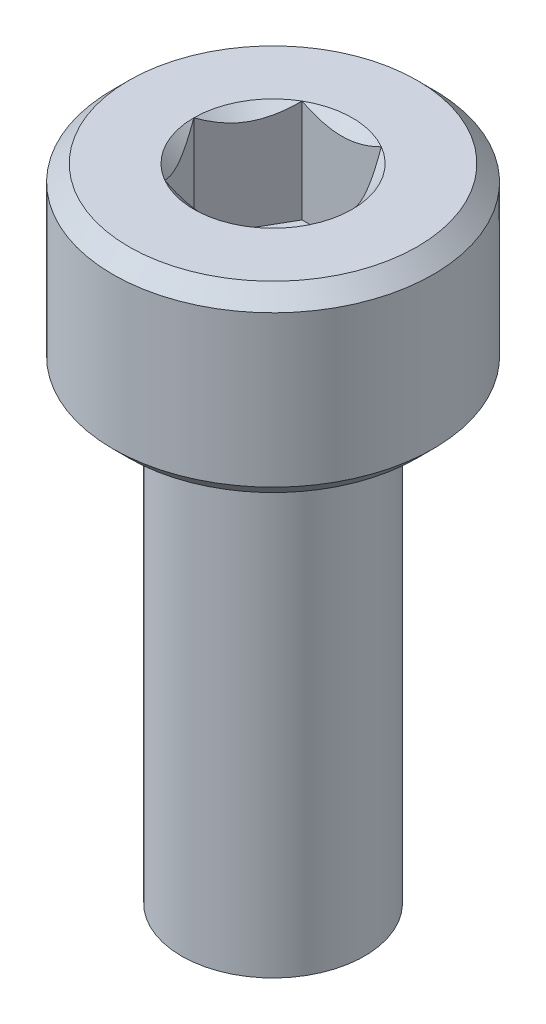
ISO-10303-21;
HEADER;
FILE_DESCRIPTION(('STEP AP214'),'2;1');
FILE_NAME('part.step','',(''),(''),'','','');
FILE_SCHEMA(('AUTOMOTIVE_DESIGN { 1 0 10303 214 1 1 1 1 }'));
ENDSEC;
DATA;
#1=APPLICATION_CONTEXT('core data for automotive mechanical design processes');
#2=APPLICATION_PROTOCOL_DEFINITION('international standard','automotive_design',2000,#1);
#3=PRODUCT_CONTEXT('',#1,'mechanical');
#4=PRODUCT('Part','Part','',(#3));
#5=PRODUCT_RELATED_PRODUCT_CATEGORY('part','',(#4));
#6=PRODUCT_DEFINITION_FORMATION('','',#4);
#7=PRODUCT_DEFINITION_CONTEXT('part definition',#1,'design');
#8=PRODUCT_DEFINITION('design','',#6,#7);
#9=PRODUCT_DEFINITION_SHAPE('','',#8);
#10=(LENGTH_UNIT() NAMED_UNIT(*) SI_UNIT(.MILLI.,.METRE.));
#11=(NAMED_UNIT(*) PLANE_ANGLE_UNIT() SI_UNIT($,.RADIAN.));
#12=(NAMED_UNIT(*) SI_UNIT($,.STERADIAN.) SOLID_ANGLE_UNIT());
#13=UNCERTAINTY_MEASURE_WITH_UNIT(LENGTH_MEASURE(1.E-05),#10,'distance_accuracy_value','');
#14=(GEOMETRIC_REPRESENTATION_CONTEXT(3) GLOBAL_UNCERTAINTY_ASSIGNED_CONTEXT((#13)) GLOBAL_UNIT_ASSIGNED_CONTEXT((#10,
#11,#12)) REPRESENTATION_CONTEXT('',''));
#15=CARTESIAN_POINT('',(0.,0.,0.));
#16=DIRECTION('',(0.,0.,1.));
#17=DIRECTION('',(1.,0.,0.));
#18=AXIS2_PLACEMENT_3D('',#15,#16,#17);
#19=CARTESIAN_POINT('',(0.,4.,0.));
#20=DIRECTION('',(0.,-1.,0.));
#21=DIRECTION('',(0.,0.,-1.));
#22=AXIS2_PLACEMENT_3D('',#19,#20,#21);
#23=CYLINDRICAL_SURFACE('',#22,3.5);
#24=CARTESIAN_POINT('',(0.,0.350000000000001,0.));
#25=DIRECTION('',(0.,1.,0.));
#26=DIRECTION('',(0.,0.,1.));
#27=AXIS2_PLACEMENT_3D('',#24,#25,#26);
#28=CIRCLE('',#27,3.5);
#29=CARTESIAN_POINT('',(0.,0.350000000000001,3.5));
#30=VERTEX_POINT('',#29);
#31=EDGE_CURVE('E222',#30,#30,#28,.T.);
#32=ORIENTED_EDGE('',*,*,#31,.T.);
#33=EDGE_LOOP('',(#32));
#34=FACE_BOUND('',#33,.T.);
#35=CARTESIAN_POINT('',(0.,3.65,0.));
#36=DIRECTION('',(0.,1.,0.));
#37=DIRECTION('',(0.,0.,1.));
#38=AXIS2_PLACEMENT_3D('',#35,#36,#37);
#39=CIRCLE('',#38,3.5);
#40=CARTESIAN_POINT('',(0.,3.65,3.5));
#41=VERTEX_POINT('',#40);
#42=EDGE_CURVE('E105',#41,#41,#39,.F.);
#43=ORIENTED_EDGE('',*,*,#42,.T.);
#44=EDGE_LOOP('',(#43));
#45=FACE_BOUND('',#44,.T.);
#46=ADVANCED_FACE('F33',(#34,#45),#23,.T.);
#47=CARTESIAN_POINT('',(0.,4.,0.));
#48=DIRECTION('',(0.,1.,0.));
#49=DIRECTION('',(0.,0.,1.));
#50=AXIS2_PLACEMENT_3D('',#47,#48,#49);
#51=PLANE('',#50);
#52=CARTESIAN_POINT('',(0.,4.,0.));
#53=DIRECTION('',(0.,1.,0.));
#54=DIRECTION('',(0.,0.,1.));
#55=AXIS2_PLACEMENT_3D('',#52,#53,#54);
#56=CIRCLE('',#55,3.15);
#57=CARTESIAN_POINT('',(0.,4.,3.15));
#58=VERTEX_POINT('',#57);
#59=EDGE_CURVE('E37',#58,#58,#56,.T.);
#60=ORIENTED_EDGE('',*,*,#59,.T.);
#61=EDGE_LOOP('',(#60));
#62=FACE_BOUND('',#61,.T.);
#63=CARTESIAN_POINT('',(0.,4.,0.));
#64=DIRECTION('',(0.,1.,0.));
#65=DIRECTION('',(0.,0.,1.));
#66=AXIS2_PLACEMENT_3D('',#63,#64,#65);
#67=CIRCLE('',#66,1.73205080756888);
#68=CARTESIAN_POINT('',(0.866025403784438,4.,1.5));
#69=VERTEX_POINT('',#68);
#70=CARTESIAN_POINT('',(1.73205080756888,4.,0.));
#71=VERTEX_POINT('',#70);
#72=EDGE_CURVE('E48',#69,#71,#67,.T.);
#73=ORIENTED_EDGE('',*,*,#72,.F.);
#74=CARTESIAN_POINT('',(-0.866025403784438,4.,1.5));
#75=VERTEX_POINT('',#74);
#76=EDGE_CURVE('E55',#75,#69,#67,.T.);
#77=ORIENTED_EDGE('',*,*,#76,.F.);
#78=CARTESIAN_POINT('',(-1.73205080756888,4.,0.));
#79=VERTEX_POINT('',#78);
#80=EDGE_CURVE('E128',#79,#75,#67,.T.);
#81=ORIENTED_EDGE('',*,*,#80,.F.);
#82=CARTESIAN_POINT('',(-0.866025403784439,4.,-1.5));
#83=VERTEX_POINT('',#82);
#84=EDGE_CURVE('E127',#83,#79,#67,.T.);
#85=ORIENTED_EDGE('',*,*,#84,.F.);
#86=CARTESIAN_POINT('',(0.866025403784438,4.,-1.5));
#87=VERTEX_POINT('',#86);
#88=EDGE_CURVE('E95',#87,#83,#67,.T.);
#89=ORIENTED_EDGE('',*,*,#88,.F.);
#90=EDGE_CURVE('E87',#71,#87,#67,.T.);
#91=ORIENTED_EDGE('',*,*,#90,.F.);
#92=EDGE_LOOP('',(#73,#77,#81,#85,#89,#91));
#93=FACE_BOUND('',#92,.T.);
#94=ADVANCED_FACE('F125',(#62,#93),#51,.T.);
#95=CARTESIAN_POINT('',(0.,0.,0.));
#96=DIRECTION('',(0.,1.,0.));
#97=DIRECTION('',(0.,0.,1.));
#98=AXIS2_PLACEMENT_3D('',#95,#96,#97);
#99=PLANE('',#98);
#100=CARTESIAN_POINT('',(0.,0.,0.));
#101=DIRECTION('',(0.,-1.,0.));
#102=DIRECTION('',(0.,0.,-1.));
#103=AXIS2_PLACEMENT_3D('',#100,#101,#102);
#104=CIRCLE('',#103,2.);
#105=CARTESIAN_POINT('',(0.,0.,-2.));
#106=VERTEX_POINT('',#105);
#107=EDGE_CURVE('E11',#106,#106,#104,.T.);
#108=ORIENTED_EDGE('',*,*,#107,.F.);
#109=EDGE_LOOP('',(#108));
#110=FACE_BOUND('',#109,.T.);
#111=CARTESIAN_POINT('',(0.,0.,0.));
#112=DIRECTION('',(0.,1.,0.));
#113=DIRECTION('',(0.,0.,1.));
#114=AXIS2_PLACEMENT_3D('',#111,#112,#113);
#115=CIRCLE('',#114,3.15);
#116=CARTESIAN_POINT('',(0.,0.,3.15));
#117=VERTEX_POINT('',#116);
#118=EDGE_CURVE('E220',#117,#117,#115,.F.);
#119=ORIENTED_EDGE('',*,*,#118,.T.);
#120=EDGE_LOOP('',(#119));
#121=FACE_BOUND('',#120,.T.);
#122=ADVANCED_FACE('F203',(#110,#121),#99,.F.);
#123=CARTESIAN_POINT('',(0.,4.,0.));
#124=DIRECTION('',(0.,1.,0.));
#125=DIRECTION('',(0.,0.,1.));
#126=AXIS2_PLACEMENT_3D('',#123,#124,#125);
#127=CONICAL_SURFACE('',#126,1.73205080756888,0.78539816339745);
#128=ORIENTED_EDGE('',*,*,#88,.T.);
#129=CARTESIAN_POINT('',(-1.72720812969692,4.55557851627079,-1.5));
#130=CARTESIAN_POINT('',(-1.68515175699268,4.52382990785743,-1.5));
#131=CARTESIAN_POINT('',(-1.64286104748673,4.49239259380738,-1.5));
#132=CARTESIAN_POINT('',(-1.55771581035942,4.43026908755641,-1.5));
#133=CARTESIAN_POINT('',(-1.51486114386668,4.3995830858922,-1.5));
#134=CARTESIAN_POINT('',(-1.3846813415127,4.30840719242716,-1.5));
#135=CARTESIAN_POINT('',(-1.29637976071654,4.24928834342677,-1.5));
#136=CARTESIAN_POINT('',(-1.11121478730467,4.1332309963165,-1.5));
#137=CARTESIAN_POINT('',(-1.01415038238167,4.07660955873301,-1.5));
#138=CARTESIAN_POINT('',(-0.815173408897606,3.97303688126565,-1.5));
#139=CARTESIAN_POINT('',(-0.713278669253285,3.92605304154167,-1.5));
#140=CARTESIAN_POINT('',(-0.560333774943112,3.86857266843083,-1.5));
#141=CARTESIAN_POINT('',(-0.511547982948042,3.85207538775725,-1.5));
#142=CARTESIAN_POINT('',(-0.412798620136866,3.822997512927,-1.5));
#143=CARTESIAN_POINT('',(-0.362834968437563,3.81041718859402,-1.5));
#144=CARTESIAN_POINT('',(-0.262863235444982,3.79003619414677,-1.5));
#145=CARTESIAN_POINT('',(-0.212872113808023,3.78215363274598,-1.5));
#146=CARTESIAN_POINT('',(-0.112355243569545,3.771322063969,-1.5));
#147=CARTESIAN_POINT('',(-0.0618295883726279,3.76837220852435,-1.5));
#148=CARTESIAN_POINT('',(0.037429173332384,3.76762485772485,-1.5));
#149=CARTESIAN_POINT('',(0.0861609672002989,3.76964473355808,-1.5));
#150=CARTESIAN_POINT('',(0.183206937768827,3.77832255289676,-1.5));
#151=CARTESIAN_POINT('',(0.231521073438269,3.78498094696846,-1.5));
#152=CARTESIAN_POINT('',(0.328199853425436,3.80268524412257,-1.5));
#153=CARTESIAN_POINT('',(0.376550616310328,3.81380581125704,-1.5));
#154=CARTESIAN_POINT('',(0.472195697125598,3.83984341404871,-1.5));
#155=CARTESIAN_POINT('',(0.51949010309274,3.85476013204094,-1.5));
#156=CARTESIAN_POINT('',(0.668391282696624,3.90733522359607,-1.5));
#157=CARTESIAN_POINT('',(0.767878709508552,3.95098128747198,-1.5));
#158=CARTESIAN_POINT('',(0.962179866690724,4.0480229945931,-1.5));
#159=CARTESIAN_POINT('',(1.05697519961444,4.10145366508953,-1.5));
#160=CARTESIAN_POINT('',(1.23814273533383,4.21168585200456,-1.5));
#161=CARTESIAN_POINT('',(1.3246994218129,4.2681879206986,-1.5));
#162=CARTESIAN_POINT('',(1.45222331290673,4.35553430157866,-1.5));
#163=CARTESIAN_POINT('',(1.49418091978756,4.38495775868004,-1.5));
#164=CARTESIAN_POINT('',(1.57752272931476,4.44458282183046,-1.5));
#165=CARTESIAN_POINT('',(1.61890708647354,4.47478421166444,-1.5));
#166=CARTESIAN_POINT('',(1.66005278019494,4.50530817860946,-1.5));
#167=B_SPLINE_CURVE_WITH_KNOTS('',3,(#129,#130,#131,#132,#133,#134,#135,#136,#137,#138,#139,
#140,#141,#142,#143,#144,#145,#146,#147,#148,#149,#150,#151,#152,#153,#154,#155,#156,#157,#158,
#159,#160,#161,#162,#163,#164,#165,#166),.UNSPECIFIED.,.F.,.F.,(4,2,2,2,2,2,2,2,2,2,2,2,2,2,2,2,
2,2,4),(0.,0.158079548982669,0.316198780993942,0.634850417346958,0.971690311361509,
1.30737131660667,1.46173961127089,1.61611853740677,1.76772101421409,1.91929742368538,
2.065387412096,2.21149159305544,2.36014984633872,2.50879566386709,2.83376031422673,
3.15991186985652,3.46985601802197,3.62358896039974,3.7772796264207),.UNSPECIFIED.);
#168=EDGE_CURVE('E100',#87,#83,#167,.F.);
#169=ORIENTED_EDGE('',*,*,#168,.F.);
#170=EDGE_LOOP('',(#128,#169));
#171=FACE_BOUND('',#170,.T.);
#172=ADVANCED_FACE('F101',(#171),#127,.F.);
#173=ORIENTED_EDGE('',*,*,#84,.T.);
#174=CARTESIAN_POINT('',(-0.865909933730601,4.00011548160007,-1.5002));
#175=CARTESIAN_POINT('',(-0.895682611594166,3.97036547606733,-1.44863220926292));
#176=CARTESIAN_POINT('',(-0.925953159489765,3.94236248391031,-1.3962020823348));
#177=CARTESIAN_POINT('',(-0.987678321317123,3.89108923044014,-1.2892909659444));
#178=CARTESIAN_POINT('',(-1.01913880822717,3.86784750504437,-1.23479980418534));
#179=CARTESIAN_POINT('',(-1.08257741237344,3.82803372899222,-1.12492091864275));
#180=CARTESIAN_POINT('',(-1.11453936608521,3.8113615856709,-1.0695611909048));
#181=CARTESIAN_POINT('',(-1.1791670593912,3.7856744568181,-0.957622742522849));
#182=CARTESIAN_POINT('',(-1.21183082354213,3.77664029047887,-0.901047443446992));
#183=CARTESIAN_POINT('',(-1.26812411040032,3.76848908122685,-0.803544610483559));
#184=CARTESIAN_POINT('',(-1.29168087824208,3.76728225298922,-0.762743091719534));
#185=CARTESIAN_POINT('',(-1.33875285845138,3.76931405716227,-0.681212030384142));
#186=CARTESIAN_POINT('',(-1.36226806050018,3.77255367074831,-0.64048250568537));
#187=CARTESIAN_POINT('',(-1.40907206156905,3.78329198598196,-0.559415597836584));
#188=CARTESIAN_POINT('',(-1.43236062923612,3.79079465301873,-0.519078615401712));
#189=CARTESIAN_POINT('',(-1.47854689118996,3.80965161192829,-0.439081663085969));
#190=CARTESIAN_POINT('',(-1.50144441326545,3.82100755701858,-0.399421991483792));
#191=CARTESIAN_POINT('',(-1.56009461325633,3.85472164759267,-0.297836865225515));
#192=CARTESIAN_POINT('',(-1.59548353987866,3.87962184909337,-0.236541446290311));
#193=CARTESIAN_POINT('',(-1.64751843074894,3.92165665327158,-0.146414371536686));
#194=CARTESIAN_POINT('',(-1.66466545167617,3.9364251535591,-0.116714860092282));
#195=CARTESIAN_POINT('',(-1.69864410935691,3.96731056594017,-0.0578620986162487));
#196=CARTESIAN_POINT('',(-1.71547589206761,3.98342683412171,-0.0287085957793624));
#197=CARTESIAN_POINT('',(-1.73216627762272,4.00011548160007,0.00020000000000028));
#198=B_SPLINE_CURVE_WITH_KNOTS('',3,(#174,#175,#176,#177,#178,#179,#180,#181,#182,#183,#184,
#185,#186,#187,#188,#189,#190,#191,#192,#193,#194,#195,#196,#197),.UNSPECIFIED.,.F.,.F.,(4,2,2,
2,2,2,2,2,2,2,2,4),(0.,0.199829143693304,0.400822987382388,0.598623720538181,0.795926240188889,
0.937113067959881,1.07833105577193,1.21968061668222,1.36109089931054,1.58570969637565,
1.69770705470964,1.80965120737194),.UNSPECIFIED.);
#199=EDGE_CURVE('E130',#83,#79,#198,.T.);
#200=ORIENTED_EDGE('',*,*,#199,.F.);
#201=EDGE_LOOP('',(#173,#200));
#202=FACE_BOUND('',#201,.T.);
#203=ADVANCED_FACE('F237',(#202),#127,.F.);
#204=ORIENTED_EDGE('',*,*,#80,.T.);
#205=CARTESIAN_POINT('',(-1.73216627762272,4.00011548160007,-0.000199999999999694));
#206=CARTESIAN_POINT('',(-1.70239359975915,3.97036547606733,0.051367790737076));
#207=CARTESIAN_POINT('',(-1.67212305186355,3.94236248391031,0.103797917665201));
#208=CARTESIAN_POINT('',(-1.61039789003619,3.89108923044014,0.210709034055597));
#209=CARTESIAN_POINT('',(-1.57893740312614,3.86784750504437,0.265200195814662));
#210=CARTESIAN_POINT('',(-1.51549879897987,3.82803372899222,0.375079081357249));
#211=CARTESIAN_POINT('',(-1.4835368452681,3.8113615856709,0.4304388090952));
#212=CARTESIAN_POINT('',(-1.41890915196211,3.7856744568181,0.542377257477151));
#213=CARTESIAN_POINT('',(-1.38624538781118,3.77664029047887,0.598952556553009));
#214=CARTESIAN_POINT('',(-1.32995210095299,3.76848908122685,0.696455389516441));
#215=CARTESIAN_POINT('',(-1.30639533311124,3.76728225298922,0.737256908280466));
#216=CARTESIAN_POINT('',(-1.25932335290193,3.76931405716227,0.818787969615858));
#217=CARTESIAN_POINT('',(-1.23580815085313,3.77255367074831,0.85951749431463));
#218=CARTESIAN_POINT('',(-1.18900414978427,3.78329198598196,0.940584402163416));
#219=CARTESIAN_POINT('',(-1.1657155821172,3.79079465301873,0.980921384598288));
#220=CARTESIAN_POINT('',(-1.11952932016335,3.80965161192829,1.06091833691403));
#221=CARTESIAN_POINT('',(-1.09663179808786,3.82100755701859,1.10057800851621));
#222=CARTESIAN_POINT('',(-1.03798159809698,3.85472164759267,1.20216313477448));
#223=CARTESIAN_POINT('',(-1.00259267147465,3.87962184909337,1.26345855370969));
#224=CARTESIAN_POINT('',(-0.950557780604375,3.92165665327158,1.35358562846331));
#225=CARTESIAN_POINT('',(-0.933410759677147,3.9364251535591,1.38328513990772));
#226=CARTESIAN_POINT('',(-0.899432101996407,3.96731056594017,1.44213790138375));
#227=CARTESIAN_POINT('',(-0.88260031928571,3.98342683412171,1.47129140422064));
#228=CARTESIAN_POINT('',(-0.865909933730601,4.00011548160007,1.5002));
#229=B_SPLINE_CURVE_WITH_KNOTS('',3,(#205,#206,#207,#208,#209,#210,#211,#212,#213,#214,#215,
#216,#217,#218,#219,#220,#221,#222,#223,#224,#225,#226,#227,#228),.UNSPECIFIED.,.F.,.F.,(4,2,2,
2,2,2,2,2,2,2,2,4),(0.,0.199829143693305,0.400822987382389,0.598623720538181,0.795926240188889,
0.937113067959881,1.07833105577193,1.21968061668222,1.36109089931054,1.58570969637565,
1.69770705470964,1.80965120737194),.UNSPECIFIED.);
#230=EDGE_CURVE('E139',#79,#75,#229,.T.);
#231=ORIENTED_EDGE('',*,*,#230,.F.);
#232=EDGE_LOOP('',(#204,#231));
#233=FACE_BOUND('',#232,.T.);
#234=ADVANCED_FACE('F252',(#233),#127,.F.);
#235=ORIENTED_EDGE('',*,*,#76,.T.);
#236=CARTESIAN_POINT('',(-1.72720812994822,4.55557851646053,1.5));
#237=CARTESIAN_POINT('',(-1.68515175723693,4.52382990803985,1.5));
#238=CARTESIAN_POINT('',(-1.64286104772391,4.49239259398251,1.5));
#239=CARTESIAN_POINT('',(-1.55771581058238,4.43026908771699,1.5));
#240=CARTESIAN_POINT('',(-1.51486114408249,4.39958308604553,1.5));
#241=CARTESIAN_POINT('',(-1.38468134170665,4.30840719255859,1.5));
#242=CARTESIAN_POINT('',(-1.29637976089561,4.24928834354366,1.5));
#243=CARTESIAN_POINT('',(-1.11121478745132,4.13323099640349,1.5));
#244=CARTESIAN_POINT('',(-1.01415038251067,4.07660955880473,1.5));
#245=CARTESIAN_POINT('',(-0.815173408989814,3.9730368813091,1.5));
#246=CARTESIAN_POINT('',(-0.71327866932636,3.92605304157206,1.5));
#247=CARTESIAN_POINT('',(-0.56033377500179,3.86857266845154,1.5));
#248=CARTESIAN_POINT('',(-0.511547983012749,3.85207538777834,1.5));
#249=CARTESIAN_POINT('',(-0.412798620213828,3.82299751294763,1.5));
#250=CARTESIAN_POINT('',(-0.362834968520751,3.8104171886138,1.5));
#251=CARTESIAN_POINT('',(-0.262863235540417,3.79003619416346,1.5));
#252=CARTESIAN_POINT('',(-0.212872113909475,3.78215363276045,1.5));
#253=CARTESIAN_POINT('',(-0.112355243682832,3.77132206397768,1.5));
#254=CARTESIAN_POINT('',(-0.061829588491731,3.76837220852945,1.5));
#255=CARTESIAN_POINT('',(0.0374291732025493,3.76762485772178,1.5));
#256=CARTESIAN_POINT('',(0.086160967065534,3.76964473355048,1.5));
#257=CARTESIAN_POINT('',(0.183206937624695,3.77832255287941,1.5));
#258=CARTESIAN_POINT('',(0.2315210732897,3.78498094694588,1.5));
#259=CARTESIAN_POINT('',(0.328199853268108,3.80268524408904,1.5));
#260=CARTESIAN_POINT('',(0.376550616148692,3.81380581121775,1.5));
#261=CARTESIAN_POINT('',(0.47219569695576,3.83984341399777,1.5));
#262=CARTESIAN_POINT('',(0.51949010291901,3.8547601319841,1.5));
#263=CARTESIAN_POINT('',(0.668391282485064,3.90733522351148,1.5));
#264=CARTESIAN_POINT('',(0.767878709264951,3.95098128736184,1.5));
#265=CARTESIAN_POINT('',(0.9621798663855,4.04802299442906,1.5));
#266=CARTESIAN_POINT('',(1.05697519927965,4.10145366489712,1.5));
#267=CARTESIAN_POINT('',(1.23814273494588,4.21168585175783,1.5));
#268=CARTESIAN_POINT('',(1.32469942140117,4.26818792042618,1.5));
#269=CARTESIAN_POINT('',(1.45222331245985,4.35553430126784,1.5));
#270=CARTESIAN_POINT('',(1.49418091932912,4.38495775835653,1.5));
#271=CARTESIAN_POINT('',(1.5775227288333,4.44458282148157,1.5));
#272=CARTESIAN_POINT('',(1.6189070859806,4.47478421130286,1.5));
#273=CARTESIAN_POINT('',(1.66005277969054,4.50530817823521,1.5));
#274=B_SPLINE_CURVE_WITH_KNOTS('',3,(#236,#237,#238,#239,#240,#241,#242,#243,#244,#245,#246,
#247,#248,#249,#250,#251,#252,#253,#254,#255,#256,#257,#258,#259,#260,#261,#262,#263,#264,#265,
#266,#267,#268,#269,#270,#271,#272,#273),.UNSPECIFIED.,.F.,.F.,(4,2,2,2,2,2,2,2,2,2,2,2,2,2,2,2,
2,2,4),(0.,0.158079549012757,0.316198781054129,0.634850417468465,0.971690311551782,
1.30737131686505,1.46173961151184,1.61611853763032,1.76772101442095,1.91929742387554,
2.06538741227089,2.21149159321503,2.36014984648185,2.50879566399376,2.83376031423511,
3.15991186974582,3.4698560178094,3.62358896013692,3.77727962610764),.UNSPECIFIED.);
#275=EDGE_CURVE('E166',#75,#69,#274,.T.);
#276=ORIENTED_EDGE('',*,*,#275,.F.);
#277=EDGE_LOOP('',(#235,#276));
#278=FACE_BOUND('',#277,.T.);
#279=ADVANCED_FACE('F282',(#278),#127,.F.);
#280=ORIENTED_EDGE('',*,*,#72,.T.);
#281=CARTESIAN_POINT('',(0.865909933730601,4.00011548160007,1.5002));
#282=CARTESIAN_POINT('',(0.895682611594166,3.97036547606733,1.44863220926292));
#283=CARTESIAN_POINT('',(0.925953159489765,3.94236248391031,1.3962020823348));
#284=CARTESIAN_POINT('',(0.987678321317124,3.89108923044014,1.2892909659444));
#285=CARTESIAN_POINT('',(1.01913880822717,3.86784750504437,1.23479980418534));
#286=CARTESIAN_POINT('',(1.08257741237344,3.82803372899222,1.12492091864275));
#287=CARTESIAN_POINT('',(1.11453936608521,3.8113615856709,1.0695611909048));
#288=CARTESIAN_POINT('',(1.1791670593912,3.7856744568181,0.95762274252285));
#289=CARTESIAN_POINT('',(1.21183082354213,3.77664029047887,0.901047443446992));
#290=CARTESIAN_POINT('',(1.26812411040032,3.76848908122685,0.80354461048356));
#291=CARTESIAN_POINT('',(1.29168087824208,3.76728225298922,0.762743091719534));
#292=CARTESIAN_POINT('',(1.33875285845138,3.76931405716227,0.681212030384142));
#293=CARTESIAN_POINT('',(1.36226806050018,3.77255367074831,0.640482505685371));
#294=CARTESIAN_POINT('',(1.40907206156905,3.78329198598196,0.559415597836584));
#295=CARTESIAN_POINT('',(1.43236062923612,3.79079465301873,0.519078615401712));
#296=CARTESIAN_POINT('',(1.47854689118996,3.80965161192829,0.43908166308597));
#297=CARTESIAN_POINT('',(1.50144441326545,3.82100755701859,0.399421991483792));
#298=CARTESIAN_POINT('',(1.56009461325633,3.85472164759267,0.297836865225515));
#299=CARTESIAN_POINT('',(1.59548353987866,3.87962184909337,0.236541446290311));
#300=CARTESIAN_POINT('',(1.64751843074894,3.92165665327158,0.146414371536686));
#301=CARTESIAN_POINT('',(1.66466545167617,3.9364251535591,0.116714860092282));
#302=CARTESIAN_POINT('',(1.69864410935691,3.96731056594017,0.0578620986162488));
#303=CARTESIAN_POINT('',(1.71547589206761,3.98342683412171,0.0287085957793626));
#304=CARTESIAN_POINT('',(1.73216627762272,4.00011548160007,-0.000200000000000026));
#305=B_SPLINE_CURVE_WITH_KNOTS('',3,(#281,#282,#283,#284,#285,#286,#287,#288,#289,#290,#291,
#292,#293,#294,#295,#296,#297,#298,#299,#300,#301,#302,#303,#304),.UNSPECIFIED.,.F.,.F.,(4,2,2,
2,2,2,2,2,2,2,2,4),(0.,0.199829143693305,0.400822987382389,0.59862372053818,0.795926240188889,
0.937113067959881,1.07833105577193,1.21968061668222,1.36109089931054,1.58570969637565,
1.69770705470964,1.80965120737194),.UNSPECIFIED.);
#306=EDGE_CURVE('E115',#69,#71,#305,.T.);
#307=ORIENTED_EDGE('',*,*,#306,.F.);
#308=EDGE_LOOP('',(#280,#307));
#309=FACE_BOUND('',#308,.T.);
#310=ADVANCED_FACE('F153',(#309),#127,.F.);
#311=ORIENTED_EDGE('',*,*,#90,.T.);
#312=CARTESIAN_POINT('',(1.73216627762272,4.00011548160007,0.000200000000000282));
#313=CARTESIAN_POINT('',(1.70239359975915,3.97036547606733,-0.0513677907370753));
#314=CARTESIAN_POINT('',(1.67212305186355,3.94236248391031,-0.103797917665201));
#315=CARTESIAN_POINT('',(1.61039789003619,3.89108923044014,-0.210709034055596));
#316=CARTESIAN_POINT('',(1.57893740312614,3.86784750504437,-0.265200195814661));
#317=CARTESIAN_POINT('',(1.51549879897987,3.82803372899222,-0.375079081357248));
#318=CARTESIAN_POINT('',(1.4835368452681,3.8113615856709,-0.430438809095199));
#319=CARTESIAN_POINT('',(1.41890915196211,3.7856744568181,-0.54237725747715));
#320=CARTESIAN_POINT('',(1.38624538781118,3.77664029047887,-0.598952556553008));
#321=CARTESIAN_POINT('',(1.32995210095299,3.76848908122685,-0.69645538951644));
#322=CARTESIAN_POINT('',(1.30639533311124,3.76728225298922,-0.737256908280466));
#323=CARTESIAN_POINT('',(1.25932335290193,3.76931405716227,-0.818787969615858));
#324=CARTESIAN_POINT('',(1.23580815085313,3.77255367074831,-0.85951749431463));
#325=CARTESIAN_POINT('',(1.18900414978427,3.78329198598196,-0.940584402163416));
#326=CARTESIAN_POINT('',(1.1657155821172,3.79079465301873,-0.980921384598288));
#327=CARTESIAN_POINT('',(1.11952932016335,3.80965161192829,-1.06091833691403));
#328=CARTESIAN_POINT('',(1.09663179808786,3.82100755701858,-1.10057800851621));
#329=CARTESIAN_POINT('',(1.03798159809698,3.85472164759267,-1.20216313477448));
#330=CARTESIAN_POINT('',(1.00259267147465,3.87962184909337,-1.26345855370969));
#331=CARTESIAN_POINT('',(0.950557780604375,3.92165665327158,-1.35358562846331));
#332=CARTESIAN_POINT('',(0.933410759677148,3.9364251535591,-1.38328513990772));
#333=CARTESIAN_POINT('',(0.899432101996407,3.96731056594017,-1.44213790138375));
#334=CARTESIAN_POINT('',(0.88260031928571,3.98342683412171,-1.47129140422064));
#335=CARTESIAN_POINT('',(0.865909933730601,4.00011548160007,-1.5002));
#336=B_SPLINE_CURVE_WITH_KNOTS('',3,(#312,#313,#314,#315,#316,#317,#318,#319,#320,#321,#322,
#323,#324,#325,#326,#327,#328,#329,#330,#331,#332,#333,#334,#335),.UNSPECIFIED.,.F.,.F.,(4,2,2,
2,2,2,2,2,2,2,2,4),(0.,0.199829143693305,0.400822987382389,0.598623720538181,0.79592624018889,
0.937113067959881,1.07833105577193,1.21968061668222,1.36109089931054,1.58570969637566,
1.69770705470964,1.80965120737194),.UNSPECIFIED.);
#337=EDGE_CURVE('E91',#71,#87,#336,.T.);
#338=ORIENTED_EDGE('',*,*,#337,.F.);
#339=EDGE_LOOP('',(#311,#338));
#340=FACE_BOUND('',#339,.T.);
#341=ADVANCED_FACE('F89',(#340),#127,.F.);
#342=CARTESIAN_POINT('',(0.,1.75,0.));
#343=DIRECTION('',(0.,1.,0.));
#344=DIRECTION('',(0.,0.,1.));
#345=AXIS2_PLACEMENT_3D('',#342,#343,#344);
#346=PLANE('',#345);
#347=DIRECTION('',(-0.5,0.,-0.866025403784439));
#348=VECTOR('',#347,1.);
#349=CARTESIAN_POINT('',(1.73205080756888,1.75,0.));
#350=LINE('',#349,#348);
#351=CARTESIAN_POINT('',(1.73205080756888,1.75,0.));
#352=VERTEX_POINT('',#351);
#353=CARTESIAN_POINT('',(0.866025403784438,1.75,-1.5));
#354=VERTEX_POINT('',#353);
#355=EDGE_CURVE('E114',#352,#354,#350,.T.);
#356=ORIENTED_EDGE('',*,*,#355,.T.);
#357=DIRECTION('',(-1.,0.,0.));
#358=VECTOR('',#357,1.);
#359=CARTESIAN_POINT('',(0.866025403784438,1.75,-1.5));
#360=LINE('',#359,#358);
#361=CARTESIAN_POINT('',(-0.866025403784439,1.75,-1.5));
#362=VERTEX_POINT('',#361);
#363=EDGE_CURVE('E119',#354,#362,#360,.T.);
#364=ORIENTED_EDGE('',*,*,#363,.T.);
#365=DIRECTION('',(-0.5,0.,0.866025403784439));
#366=VECTOR('',#365,1.);
#367=CARTESIAN_POINT('',(-0.866025403784439,1.75,-1.5));
#368=LINE('',#367,#366);
#369=CARTESIAN_POINT('',(-1.73205080756888,1.75,0.));
#370=VERTEX_POINT('',#369);
#371=EDGE_CURVE('E276',#362,#370,#368,.T.);
#372=ORIENTED_EDGE('',*,*,#371,.T.);
#373=DIRECTION('',(0.5,0.,0.866025403784439));
#374=VECTOR('',#373,1.);
#375=CARTESIAN_POINT('',(-1.73205080756888,1.75,0.));
#376=LINE('',#375,#374);
#377=CARTESIAN_POINT('',(-0.866025403784438,1.75,1.5));
#378=VERTEX_POINT('',#377);
#379=EDGE_CURVE('E259',#370,#378,#376,.T.);
#380=ORIENTED_EDGE('',*,*,#379,.T.);
#381=DIRECTION('',(1.,0.,0.));
#382=VECTOR('',#381,1.);
#383=CARTESIAN_POINT('',(-0.866025403784438,1.75,1.5));
#384=LINE('',#383,#382);
#385=CARTESIAN_POINT('',(0.866025403784439,1.75,1.5));
#386=VERTEX_POINT('',#385);
#387=EDGE_CURVE('E272',#378,#386,#384,.T.);
#388=ORIENTED_EDGE('',*,*,#387,.T.);
#389=DIRECTION('',(0.5,0.,-0.866025403784439));
#390=VECTOR('',#389,1.);
#391=CARTESIAN_POINT('',(0.866025403784439,1.75,1.5));
#392=LINE('',#391,#390);
#393=EDGE_CURVE('E122',#386,#352,#392,.T.);
#394=ORIENTED_EDGE('',*,*,#393,.T.);
#395=EDGE_LOOP('',(#356,#364,#372,#380,#388,#394));
#396=FACE_BOUND('',#395,.T.);
#397=ADVANCED_FACE('F152',(#396),#346,.T.);
#398=CARTESIAN_POINT('',(0.866025403784438,1.75,-1.5));
#399=DIRECTION('',(0.,0.,-1.));
#400=DIRECTION('',(-1.,0.,0.));
#401=AXIS2_PLACEMENT_3D('',#398,#399,#400);
#402=PLANE('',#401);
#403=DIRECTION('',(0.,1.,0.));
#404=VECTOR('',#403,1.);
#405=CARTESIAN_POINT('',(0.866025403784438,1.75,-1.5));
#406=LINE('',#405,#404);
#407=EDGE_CURVE('E112',#354,#87,#406,.T.);
#408=ORIENTED_EDGE('',*,*,#407,.T.);
#409=ORIENTED_EDGE('',*,*,#168,.T.);
#410=DIRECTION('',(0.,1.,0.));
#411=VECTOR('',#410,1.);
#412=CARTESIAN_POINT('',(-0.866025403784439,1.75,-1.5));
#413=LINE('',#412,#411);
#414=EDGE_CURVE('E121',#362,#83,#413,.T.);
#415=ORIENTED_EDGE('',*,*,#414,.F.);
#416=ORIENTED_EDGE('',*,*,#363,.F.);
#417=EDGE_LOOP('',(#408,#409,#415,#416));
#418=FACE_BOUND('',#417,.T.);
#419=ADVANCED_FACE('F117',(#418),#402,.F.);
#420=CARTESIAN_POINT('',(-0.866025403784439,1.75,-1.5));
#421=DIRECTION('',(-0.866025403784439,0.,-0.5));
#422=DIRECTION('',(-0.5,0.,0.866025403784439));
#423=AXIS2_PLACEMENT_3D('',#420,#421,#422);
#424=PLANE('',#423);
#425=ORIENTED_EDGE('',*,*,#414,.T.);
#426=ORIENTED_EDGE('',*,*,#199,.T.);
#427=DIRECTION('',(0.,1.,0.));
#428=VECTOR('',#427,1.);
#429=CARTESIAN_POINT('',(-1.73205080756888,1.75,0.));
#430=LINE('',#429,#428);
#431=EDGE_CURVE('E255',#370,#79,#430,.T.);
#432=ORIENTED_EDGE('',*,*,#431,.F.);
#433=ORIENTED_EDGE('',*,*,#371,.F.);
#434=EDGE_LOOP('',(#425,#426,#432,#433));
#435=FACE_BOUND('',#434,.T.);
#436=ADVANCED_FACE('F145',(#435),#424,.F.);
#437=CARTESIAN_POINT('',(-1.73205080756888,1.75,0.));
#438=DIRECTION('',(-0.866025403784439,0.,0.5));
#439=DIRECTION('',(0.5,0.,0.866025403784439));
#440=AXIS2_PLACEMENT_3D('',#437,#438,#439);
#441=PLANE('',#440);
#442=ORIENTED_EDGE('',*,*,#431,.T.);
#443=ORIENTED_EDGE('',*,*,#230,.T.);
#444=DIRECTION('',(0.,1.,0.));
#445=VECTOR('',#444,1.);
#446=CARTESIAN_POINT('',(-0.866025403784438,1.75,1.5));
#447=LINE('',#446,#445);
#448=EDGE_CURVE('E261',#378,#75,#447,.T.);
#449=ORIENTED_EDGE('',*,*,#448,.F.);
#450=ORIENTED_EDGE('',*,*,#379,.F.);
#451=EDGE_LOOP('',(#442,#443,#449,#450));
#452=FACE_BOUND('',#451,.T.);
#453=ADVANCED_FACE('F187',(#452),#441,.F.);
#454=CARTESIAN_POINT('',(-0.866025403784438,1.75,1.5));
#455=DIRECTION('',(0.,0.,1.));
#456=DIRECTION('',(1.,0.,0.));
#457=AXIS2_PLACEMENT_3D('',#454,#455,#456);
#458=PLANE('',#457);
#459=ORIENTED_EDGE('',*,*,#448,.T.);
#460=ORIENTED_EDGE('',*,*,#275,.T.);
#461=DIRECTION('',(0.,1.,0.));
#462=VECTOR('',#461,1.);
#463=CARTESIAN_POINT('',(0.866025403784439,1.75,1.5));
#464=LINE('',#463,#462);
#465=EDGE_CURVE('E263',#386,#69,#464,.T.);
#466=ORIENTED_EDGE('',*,*,#465,.F.);
#467=ORIENTED_EDGE('',*,*,#387,.F.);
#468=EDGE_LOOP('',(#459,#460,#466,#467));
#469=FACE_BOUND('',#468,.T.);
#470=ADVANCED_FACE('F183',(#469),#458,.F.);
#471=CARTESIAN_POINT('',(0.866025403784439,1.75,1.5));
#472=DIRECTION('',(0.866025403784439,0.,0.5));
#473=DIRECTION('',(0.5,0.,-0.866025403784439));
#474=AXIS2_PLACEMENT_3D('',#471,#472,#473);
#475=PLANE('',#474);
#476=ORIENTED_EDGE('',*,*,#465,.T.);
#477=ORIENTED_EDGE('',*,*,#306,.T.);
#478=DIRECTION('',(0.,1.,0.));
#479=VECTOR('',#478,1.);
#480=CARTESIAN_POINT('',(1.73205080756888,1.75,0.));
#481=LINE('',#480,#479);
#482=EDGE_CURVE('E106',#352,#71,#481,.T.);
#483=ORIENTED_EDGE('',*,*,#482,.F.);
#484=ORIENTED_EDGE('',*,*,#393,.F.);
#485=EDGE_LOOP('',(#476,#477,#483,#484));
#486=FACE_BOUND('',#485,.T.);
#487=ADVANCED_FACE('F180',(#486),#475,.F.);
#488=CARTESIAN_POINT('',(1.73205080756888,1.75,0.));
#489=DIRECTION('',(0.866025403784439,0.,-0.5));
#490=DIRECTION('',(-0.5,0.,-0.866025403784439));
#491=AXIS2_PLACEMENT_3D('',#488,#489,#490);
#492=PLANE('',#491);
#493=ORIENTED_EDGE('',*,*,#482,.T.);
#494=ORIENTED_EDGE('',*,*,#337,.T.);
#495=ORIENTED_EDGE('',*,*,#407,.F.);
#496=ORIENTED_EDGE('',*,*,#355,.F.);
#497=EDGE_LOOP('',(#493,#494,#495,#496));
#498=FACE_BOUND('',#497,.T.);
#499=ADVANCED_FACE('F110',(#498),#492,.F.);
#500=CARTESIAN_POINT('',(0.,0.350000000000001,0.));
#501=DIRECTION('',(0.,1.,0.));
#502=DIRECTION('',(0.,0.,1.));
#503=AXIS2_PLACEMENT_3D('',#500,#501,#502);
#504=CONICAL_SURFACE('',#503,3.5,0.78539816339745);
#505=ORIENTED_EDGE('',*,*,#118,.F.);
#506=EDGE_LOOP('',(#505));
#507=FACE_BOUND('',#506,.T.);
#508=ORIENTED_EDGE('',*,*,#31,.F.);
#509=EDGE_LOOP('',(#508));
#510=FACE_BOUND('',#509,.T.);
#511=ADVANCED_FACE('F209',(#507,#510),#504,.T.);
#512=CARTESIAN_POINT('',(0.,4.,0.));
#513=DIRECTION('',(0.,-1.,0.));
#514=DIRECTION('',(0.,0.,-1.));
#515=AXIS2_PLACEMENT_3D('',#512,#513,#514);
#516=CONICAL_SURFACE('',#515,3.15,0.785398163397448);
#517=ORIENTED_EDGE('',*,*,#42,.F.);
#518=EDGE_LOOP('',(#517));
#519=FACE_BOUND('',#518,.T.);
#520=ORIENTED_EDGE('',*,*,#59,.F.);
#521=EDGE_LOOP('',(#520));
#522=FACE_BOUND('',#521,.T.);
#523=ADVANCED_FACE('F35',(#519,#522),#516,.T.);
#524=CARTESIAN_POINT('',(0.,-10.,0.));
#525=DIRECTION('',(0.,1.,0.));
#526=DIRECTION('',(0.,0.,1.));
#527=AXIS2_PLACEMENT_3D('',#524,#525,#526);
#528=CYLINDRICAL_SURFACE('',#527,2.);
#529=CARTESIAN_POINT('',(0.,-10.,0.));
#530=DIRECTION('',(0.,-1.,0.));
#531=DIRECTION('',(0.,0.,-1.));
#532=AXIS2_PLACEMENT_3D('',#529,#530,#531);
#533=CIRCLE('',#532,2.);
#534=CARTESIAN_POINT('',(0.,-10.,-2.));
#535=VERTEX_POINT('',#534);
#536=EDGE_CURVE('E248',#535,#535,#533,.T.);
#537=ORIENTED_EDGE('',*,*,#536,.F.);
#538=EDGE_LOOP('',(#537));
#539=FACE_BOUND('',#538,.T.);
#540=ORIENTED_EDGE('',*,*,#107,.T.);
#541=EDGE_LOOP('',(#540));
#542=FACE_BOUND('',#541,.T.);
#543=ADVANCED_FACE('F154',(#539,#542),#528,.T.);
#544=CARTESIAN_POINT('',(0.,-10.,0.));
#545=DIRECTION('',(0.,-1.,0.));
#546=DIRECTION('',(0.,0.,-1.));
#547=AXIS2_PLACEMENT_3D('',#544,#545,#546);
#548=PLANE('',#547);
#549=ORIENTED_EDGE('',*,*,#536,.T.);
#550=EDGE_LOOP('',(#549));
#551=FACE_BOUND('',#550,.T.);
#552=ADVANCED_FACE('F241',(#551),#548,.T.);
#553=CLOSED_SHELL('',(#46,#94,#122,#172,#203,#234,#279,#310,#341,#397,#419,#436,#453,#470,#487,
#499,#511,#523,#543,#552));
#554=MANIFOLD_SOLID_BREP('B2',#553);
#555=ADVANCED_BREP_SHAPE_REPRESENTATION('',(#18,#554),#14);
#556=SHAPE_DEFINITION_REPRESENTATION(#9,#555);
ENDSEC;
END-ISO-10303-21;
